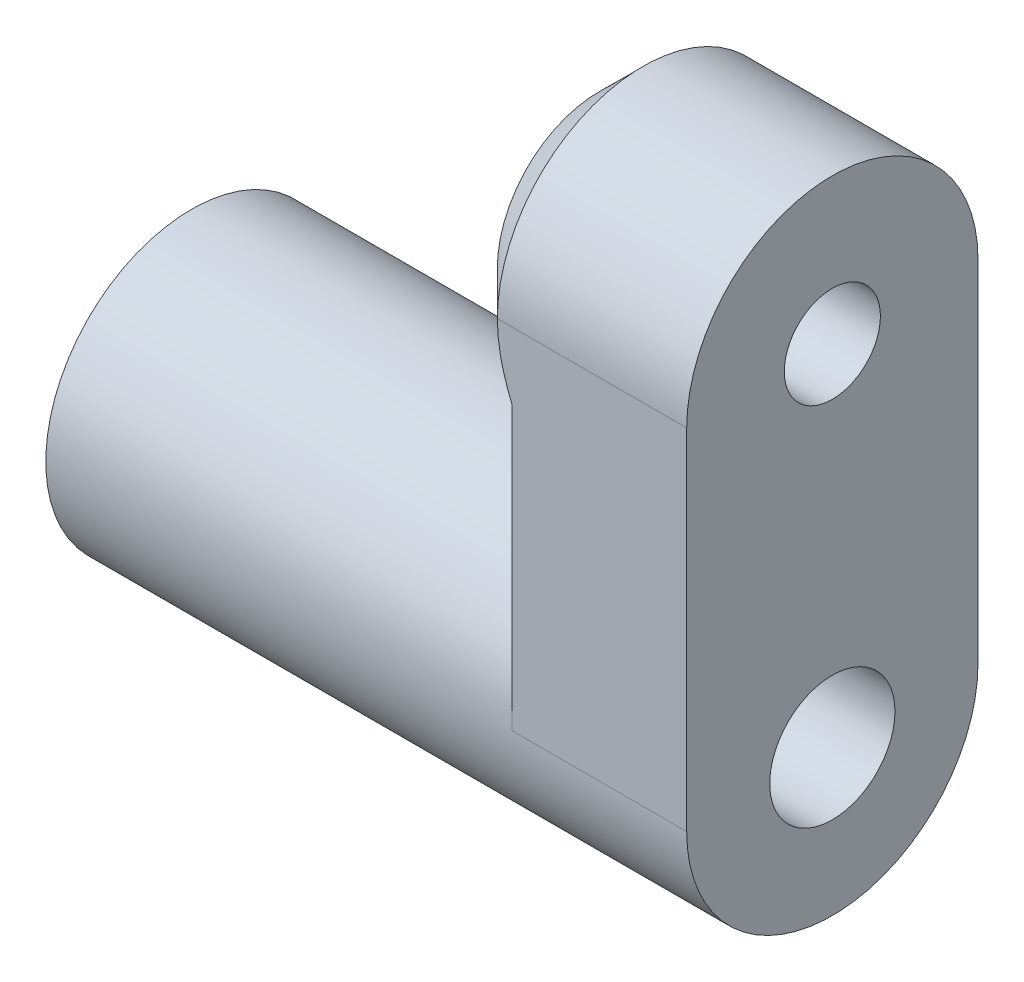
ISO-10303-21;
HEADER;
FILE_DESCRIPTION(('STEP AP214'),'2;1');
FILE_NAME('part.step','',(''),(''),'','','');
FILE_SCHEMA(('AUTOMOTIVE_DESIGN { 1 0 10303 214 1 1 1 1 }'));
ENDSEC;
DATA;
#1=APPLICATION_CONTEXT('core data for automotive mechanical design processes');
#2=APPLICATION_PROTOCOL_DEFINITION('international standard','automotive_design',2000,#1);
#3=PRODUCT_CONTEXT('',#1,'mechanical');
#4=PRODUCT('Part','Part','',(#3));
#5=PRODUCT_RELATED_PRODUCT_CATEGORY('part','',(#4));
#6=PRODUCT_DEFINITION_FORMATION('','',#4);
#7=PRODUCT_DEFINITION_CONTEXT('part definition',#1,'design');
#8=PRODUCT_DEFINITION('design','',#6,#7);
#9=PRODUCT_DEFINITION_SHAPE('','',#8);
#10=(LENGTH_UNIT() NAMED_UNIT(*) SI_UNIT(.MILLI.,.METRE.));
#11=(NAMED_UNIT(*) PLANE_ANGLE_UNIT() SI_UNIT($,.RADIAN.));
#12=(NAMED_UNIT(*) SI_UNIT($,.STERADIAN.) SOLID_ANGLE_UNIT());
#13=UNCERTAINTY_MEASURE_WITH_UNIT(LENGTH_MEASURE(1.E-05),#10,'distance_accuracy_value','');
#14=(GEOMETRIC_REPRESENTATION_CONTEXT(3) GLOBAL_UNCERTAINTY_ASSIGNED_CONTEXT((#13)) GLOBAL_UNIT_ASSIGNED_CONTEXT((#10,
#11,#12)) REPRESENTATION_CONTEXT('',''));
#15=CARTESIAN_POINT('',(0.,0.,0.));
#16=DIRECTION('',(0.,0.,1.));
#17=DIRECTION('',(1.,0.,0.));
#18=AXIS2_PLACEMENT_3D('',#15,#16,#17);
#19=CARTESIAN_POINT('',(16.,0.,0.));
#20=DIRECTION('',(1.,0.,0.));
#21=DIRECTION('',(0.,0.,-1.));
#22=AXIS2_PLACEMENT_3D('',#19,#20,#21);
#23=PLANE('',#22);
#24=DIRECTION('',(0.,-1.,0.));
#25=VECTOR('',#24,1.);
#26=CARTESIAN_POINT('',(16.,0.,5.));
#27=LINE('',#26,#25);
#28=CARTESIAN_POINT('',(16.,9.70871215252205,5.));
#29=VERTEX_POINT('',#28);
#30=CARTESIAN_POINT('',(16.,0.,5.));
#31=VERTEX_POINT('',#30);
#32=EDGE_CURVE('E176',#29,#31,#27,.T.);
#33=ORIENTED_EDGE('',*,*,#32,.F.);
#34=CARTESIAN_POINT('',(16.,12.,0.));
#35=DIRECTION('',(1.,0.,0.));
#36=DIRECTION('',(0.,0.,-1.));
#37=AXIS2_PLACEMENT_3D('',#34,#35,#36);
#38=CIRCLE('',#37,5.50000000000001);
#39=CARTESIAN_POINT('',(16.,9.70871215252205,-5.));
#40=VERTEX_POINT('',#39);
#41=EDGE_CURVE('E130',#29,#40,#38,.T.);
#42=ORIENTED_EDGE('',*,*,#41,.T.);
#43=DIRECTION('',(0.,-1.,0.));
#44=VECTOR('',#43,1.);
#45=CARTESIAN_POINT('',(16.,0.,-5.));
#46=LINE('',#45,#44);
#47=CARTESIAN_POINT('',(16.,0.,-5.));
#48=VERTEX_POINT('',#47);
#49=EDGE_CURVE('E179',#40,#48,#46,.T.);
#50=ORIENTED_EDGE('',*,*,#49,.T.);
#51=CARTESIAN_POINT('',(16.,0.,0.));
#52=DIRECTION('',(1.,0.,0.));
#53=DIRECTION('',(0.,0.,-1.));
#54=AXIS2_PLACEMENT_3D('',#51,#52,#53);
#55=CIRCLE('',#54,5.);
#56=EDGE_CURVE('E127',#48,#31,#55,.T.);
#57=ORIENTED_EDGE('',*,*,#56,.T.);
#58=EDGE_LOOP('',(#33,#42,#50,#57));
#59=FACE_BOUND('',#58,.T.);
#60=ADVANCED_FACE('F47',(#59),#23,.F.);
#61=CARTESIAN_POINT('',(0.,0.,0.));
#62=DIRECTION('',(1.,0.,0.));
#63=DIRECTION('',(0.,0.,-1.));
#64=AXIS2_PLACEMENT_3D('',#61,#62,#63);
#65=PLANE('',#64);
#66=CARTESIAN_POINT('',(0.,0.,0.));
#67=DIRECTION('',(1.,0.,0.));
#68=DIRECTION('',(0.,0.,-1.));
#69=AXIS2_PLACEMENT_3D('',#66,#67,#68);
#70=CIRCLE('',#69,5.);
#71=CARTESIAN_POINT('',(0.,0.,-5.));
#72=VERTEX_POINT('',#71);
#73=EDGE_CURVE('E121',#72,#72,#70,.T.);
#74=ORIENTED_EDGE('',*,*,#73,.F.);
#75=EDGE_LOOP('',(#74));
#76=FACE_BOUND('',#75,.T.);
#77=CARTESIAN_POINT('',(0.,0.,0.));
#78=DIRECTION('',(1.,0.,0.));
#79=DIRECTION('',(0.,0.,-1.));
#80=AXIS2_PLACEMENT_3D('',#77,#78,#79);
#81=CIRCLE('',#80,2.15);
#82=CARTESIAN_POINT('',(0.,0.,-2.15));
#83=VERTEX_POINT('',#82);
#84=EDGE_CURVE('E118',#83,#83,#81,.T.);
#85=ORIENTED_EDGE('',*,*,#84,.T.);
#86=EDGE_LOOP('',(#85));
#87=FACE_BOUND('',#86,.T.);
#88=ADVANCED_FACE('F161',(#76,#87),#65,.F.);
#89=CARTESIAN_POINT('',(16.,0.,0.));
#90=DIRECTION('',(-1.,0.,0.));
#91=DIRECTION('',(0.,0.,1.));
#92=AXIS2_PLACEMENT_3D('',#89,#90,#91);
#93=CYLINDRICAL_SURFACE('',#92,5.);
#94=ORIENTED_EDGE('',*,*,#56,.F.);
#95=DIRECTION('',(-1.,0.,0.));
#96=VECTOR('',#95,1.);
#97=CARTESIAN_POINT('',(22.,0.,-5.));
#98=LINE('',#97,#96);
#99=CARTESIAN_POINT('',(22.,0.,-5.));
#100=VERTEX_POINT('',#99);
#101=EDGE_CURVE('E123',#100,#48,#98,.T.);
#102=ORIENTED_EDGE('',*,*,#101,.F.);
#103=CARTESIAN_POINT('',(22.,0.,0.));
#104=DIRECTION('',(1.,0.,0.));
#105=DIRECTION('',(0.,0.,-1.));
#106=AXIS2_PLACEMENT_3D('',#103,#104,#105);
#107=CIRCLE('',#106,5.);
#108=CARTESIAN_POINT('',(22.,0.,5.));
#109=VERTEX_POINT('',#108);
#110=EDGE_CURVE('E105',#109,#100,#107,.T.);
#111=ORIENTED_EDGE('',*,*,#110,.F.);
#112=DIRECTION('',(-1.,0.,0.));
#113=VECTOR('',#112,1.);
#114=CARTESIAN_POINT('',(22.,0.,5.));
#115=LINE('',#114,#113);
#116=EDGE_CURVE('E102',#109,#31,#115,.T.);
#117=ORIENTED_EDGE('',*,*,#116,.T.);
#118=EDGE_LOOP('',(#94,#102,#111,#117));
#119=FACE_BOUND('',#118,.T.);
#120=ORIENTED_EDGE('',*,*,#73,.T.);
#121=EDGE_LOOP('',(#120));
#122=FACE_BOUND('',#121,.T.);
#123=ADVANCED_FACE('F159',(#119,#122),#93,.T.);
#124=CARTESIAN_POINT('',(16.,0.,0.));
#125=DIRECTION('',(-1.,0.,0.));
#126=DIRECTION('',(0.,0.,1.));
#127=AXIS2_PLACEMENT_3D('',#124,#125,#126);
#128=CYLINDRICAL_SURFACE('',#127,2.15);
#129=ORIENTED_EDGE('',*,*,#84,.F.);
#130=EDGE_LOOP('',(#129));
#131=FACE_BOUND('',#130,.T.);
#132=CARTESIAN_POINT('',(22.,0.,0.));
#133=DIRECTION('',(1.,0.,0.));
#134=DIRECTION('',(0.,0.,-1.));
#135=AXIS2_PLACEMENT_3D('',#132,#133,#134);
#136=CIRCLE('',#135,2.15);
#137=CARTESIAN_POINT('',(22.,0.,-2.15));
#138=VERTEX_POINT('',#137);
#139=EDGE_CURVE('E191',#138,#138,#136,.F.);
#140=ORIENTED_EDGE('',*,*,#139,.F.);
#141=EDGE_LOOP('',(#140));
#142=FACE_BOUND('',#141,.T.);
#143=ADVANCED_FACE('F153',(#131,#142),#128,.F.);
#144=CARTESIAN_POINT('',(22.,12.,0.));
#145=DIRECTION('',(-1.,0.,0.));
#146=DIRECTION('',(0.,0.,1.));
#147=AXIS2_PLACEMENT_3D('',#144,#145,#146);
#148=CYLINDRICAL_SURFACE('',#147,5.);
#149=DIRECTION('',(-1.,0.,0.));
#150=VECTOR('',#149,1.);
#151=CARTESIAN_POINT('',(22.,12.,-5.));
#152=LINE('',#151,#150);
#153=CARTESIAN_POINT('',(22.,12.,-5.));
#154=VERTEX_POINT('',#153);
#155=CARTESIAN_POINT('',(15.5,12.,-5.));
#156=VERTEX_POINT('',#155);
#157=EDGE_CURVE('E75',#154,#156,#152,.T.);
#158=ORIENTED_EDGE('',*,*,#157,.T.);
#159=CARTESIAN_POINT('',(15.5,12.,0.));
#160=DIRECTION('',(1.,0.,0.));
#161=DIRECTION('',(0.,0.,-1.));
#162=AXIS2_PLACEMENT_3D('',#159,#160,#161);
#163=CIRCLE('',#162,5.);
#164=CARTESIAN_POINT('',(15.5,12.,5.));
#165=VERTEX_POINT('',#164);
#166=EDGE_CURVE('E62',#156,#165,#163,.T.);
#167=ORIENTED_EDGE('',*,*,#166,.T.);
#168=DIRECTION('',(-1.,0.,0.));
#169=VECTOR('',#168,1.);
#170=CARTESIAN_POINT('',(22.,12.,5.));
#171=LINE('',#170,#169);
#172=CARTESIAN_POINT('',(22.,12.,5.));
#173=VERTEX_POINT('',#172);
#174=EDGE_CURVE('E68',#173,#165,#171,.T.);
#175=ORIENTED_EDGE('',*,*,#174,.F.);
#176=CARTESIAN_POINT('',(22.,12.,0.));
#177=DIRECTION('',(1.,0.,0.));
#178=DIRECTION('',(0.,0.,-1.));
#179=AXIS2_PLACEMENT_3D('',#176,#177,#178);
#180=CIRCLE('',#179,5.);
#181=EDGE_CURVE('E106',#154,#173,#180,.T.);
#182=ORIENTED_EDGE('',*,*,#181,.F.);
#183=EDGE_LOOP('',(#158,#167,#175,#182));
#184=FACE_BOUND('',#183,.T.);
#185=ADVANCED_FACE('F115',(#184),#148,.T.);
#186=CARTESIAN_POINT('',(22.,0.,5.));
#187=DIRECTION('',(0.,0.,-1.));
#188=DIRECTION('',(0.,1.,0.));
#189=AXIS2_PLACEMENT_3D('',#186,#187,#188);
#190=PLANE('',#189);
#191=ORIENTED_EDGE('',*,*,#174,.T.);
#192=CARTESIAN_POINT('',(15.5,12.,5.));
#193=CARTESIAN_POINT('',(15.4999938808641,11.9232845514094,5.));
#194=CARTESIAN_POINT('',(15.5017664645557,11.8465805571081,5.));
#195=CARTESIAN_POINT('',(15.5088113614359,11.6933450860362,5.));
#196=CARTESIAN_POINT('',(15.5140831273911,11.6168135841673,5.));
#197=CARTESIAN_POINT('',(15.5350373481858,11.3879305785124,5.));
#198=CARTESIAN_POINT('',(15.5558591226562,11.2360240896686,5.));
#199=CARTESIAN_POINT('',(15.6097448587274,10.9365440688364,5.));
#200=CARTESIAN_POINT('',(15.6426424330577,10.788939781945,5.));
#201=CARTESIAN_POINT('',(15.7192338848682,10.4965656361896,5.));
#202=CARTESIAN_POINT('',(15.7629287587174,10.3517960402407,5.));
#203=CARTESIAN_POINT('',(15.8396339438448,10.1243701547718,5.));
#204=CARTESIAN_POINT('',(15.8696377446425,10.0406780069047,5.));
#205=CARTESIAN_POINT('',(15.9326535749736,9.87404381596682,5.));
#206=CARTESIAN_POINT('',(15.9656773190533,9.79110619565018,5.));
#207=CARTESIAN_POINT('',(16.,9.70871215252204,5.));
#208=B_SPLINE_CURVE_WITH_KNOTS('',3,(#192,#193,#194,#195,#196,#197,#198,#199,#200,#201,#202,
#203,#204,#205,#206,#207),.UNSPECIFIED.,.F.,.F.,(4,2,2,2,2,2,2,4),(0.,0.230103965457578,
0.460171953668387,0.919511473698916,1.37274597747733,1.82602232112228,2.09269913724655,
2.36045824725333),.UNSPECIFIED.);
#209=EDGE_CURVE('E11',#165,#29,#208,.T.);
#210=ORIENTED_EDGE('',*,*,#209,.T.);
#211=ORIENTED_EDGE('',*,*,#32,.T.);
#212=ORIENTED_EDGE('',*,*,#116,.F.);
#213=DIRECTION('',(0.,-1.,0.));
#214=VECTOR('',#213,1.);
#215=CARTESIAN_POINT('',(22.,0.,5.));
#216=LINE('',#215,#214);
#217=EDGE_CURVE('E98',#173,#109,#216,.T.);
#218=ORIENTED_EDGE('',*,*,#217,.F.);
#219=EDGE_LOOP('',(#191,#210,#211,#212,#218));
#220=FACE_BOUND('',#219,.T.);
#221=ADVANCED_FACE('F100',(#220),#190,.F.);
#222=CARTESIAN_POINT('',(22.,0.,-5.));
#223=DIRECTION('',(0.,0.,-1.));
#224=DIRECTION('',(0.,1.,0.));
#225=AXIS2_PLACEMENT_3D('',#222,#223,#224);
#226=PLANE('',#225);
#227=ORIENTED_EDGE('',*,*,#49,.F.);
#228=CARTESIAN_POINT('',(16.,9.70871215252205,-5.));
#229=CARTESIAN_POINT('',(15.9240808009228,9.89084793552308,-5.));
#230=CARTESIAN_POINT('',(15.8544564809825,10.0759888500897,-5.));
#231=CARTESIAN_POINT('',(15.7319135578911,10.4496426129944,-5.));
#232=CARTESIAN_POINT('',(15.6788364246005,10.6381039484844,-5.));
#233=CARTESIAN_POINT('',(15.6135633036609,10.9242681078303,-5.));
#234=CARTESIAN_POINT('',(15.5941836427533,11.0203343069844,-5.));
#235=CARTESIAN_POINT('',(15.5606081991895,11.2133708835708,-5.));
#236=CARTESIAN_POINT('',(15.5464121712465,11.310341217997,-5.));
#237=CARTESIAN_POINT('',(15.5234087589426,11.5058960835902,-5.));
#238=CARTESIAN_POINT('',(15.5146560425683,11.6044870950536,-5.));
#239=CARTESIAN_POINT('',(15.502938452585,11.8020489039693,-5.));
#240=CARTESIAN_POINT('',(15.4999758026711,11.9010198327149,-5.));
#241=CARTESIAN_POINT('',(15.5,12.,-5.));
#242=B_SPLINE_CURVE_WITH_KNOTS('',3,(#228,#229,#230,#231,#232,#233,#234,#235,#236,#237,#238,
#239,#240,#241),.UNSPECIFIED.,.F.,.F.,(4,2,2,2,2,2,4),(0.,0.592418733123167,1.17897377993223,
1.47284954457351,1.76671140137237,2.06347881375194,2.36036017831086),.UNSPECIFIED.);
#243=EDGE_CURVE('E135',#40,#156,#242,.T.);
#244=ORIENTED_EDGE('',*,*,#243,.T.);
#245=ORIENTED_EDGE('',*,*,#157,.F.);
#246=DIRECTION('',(0.,-1.,0.));
#247=VECTOR('',#246,1.);
#248=CARTESIAN_POINT('',(22.,0.,-5.));
#249=LINE('',#248,#247);
#250=EDGE_CURVE('E112',#154,#100,#249,.T.);
#251=ORIENTED_EDGE('',*,*,#250,.T.);
#252=ORIENTED_EDGE('',*,*,#101,.T.);
#253=EDGE_LOOP('',(#227,#244,#245,#251,#252));
#254=FACE_BOUND('',#253,.T.);
#255=ADVANCED_FACE('F141',(#254),#226,.T.);
#256=CARTESIAN_POINT('',(22.,12.,0.));
#257=DIRECTION('',(-1.,0.,0.));
#258=DIRECTION('',(0.,0.,1.));
#259=AXIS2_PLACEMENT_3D('',#256,#257,#258);
#260=CYLINDRICAL_SURFACE('',#259,1.65);
#261=CARTESIAN_POINT('',(22.,12.,0.));
#262=DIRECTION('',(1.,0.,0.));
#263=DIRECTION('',(0.,0.,-1.));
#264=AXIS2_PLACEMENT_3D('',#261,#262,#263);
#265=CIRCLE('',#264,1.65);
#266=CARTESIAN_POINT('',(22.,12.,-1.65));
#267=VERTEX_POINT('',#266);
#268=EDGE_CURVE('E113',#267,#267,#265,.T.);
#269=ORIENTED_EDGE('',*,*,#268,.T.);
#270=EDGE_LOOP('',(#269));
#271=FACE_BOUND('',#270,.T.);
#272=CARTESIAN_POINT('',(14.,12.,0.));
#273=DIRECTION('',(-1.,0.,0.));
#274=DIRECTION('',(0.,0.,1.));
#275=AXIS2_PLACEMENT_3D('',#272,#273,#274);
#276=CIRCLE('',#275,1.65);
#277=CARTESIAN_POINT('',(14.,12.,1.65));
#278=VERTEX_POINT('',#277);
#279=EDGE_CURVE('E199',#278,#278,#276,.T.);
#280=ORIENTED_EDGE('',*,*,#279,.T.);
#281=EDGE_LOOP('',(#280));
#282=FACE_BOUND('',#281,.T.);
#283=ADVANCED_FACE('F145',(#271,#282),#260,.F.);
#284=CARTESIAN_POINT('',(22.,0.,0.));
#285=DIRECTION('',(1.,0.,0.));
#286=DIRECTION('',(0.,0.,-1.));
#287=AXIS2_PLACEMENT_3D('',#284,#285,#286);
#288=PLANE('',#287);
#289=ORIENTED_EDGE('',*,*,#268,.F.);
#290=EDGE_LOOP('',(#289));
#291=FACE_BOUND('',#290,.T.);
#292=ORIENTED_EDGE('',*,*,#181,.T.);
#293=ORIENTED_EDGE('',*,*,#217,.T.);
#294=ORIENTED_EDGE('',*,*,#110,.T.);
#295=ORIENTED_EDGE('',*,*,#250,.F.);
#296=EDGE_LOOP('',(#292,#293,#294,#295));
#297=FACE_BOUND('',#296,.T.);
#298=ORIENTED_EDGE('',*,*,#139,.T.);
#299=EDGE_LOOP('',(#298));
#300=FACE_BOUND('',#299,.T.);
#301=ADVANCED_FACE('F109',(#291,#297,#300),#288,.T.);
#302=CARTESIAN_POINT('',(14.,12.,0.));
#303=DIRECTION('',(-1.,0.,0.));
#304=DIRECTION('',(0.,0.,1.));
#305=AXIS2_PLACEMENT_3D('',#302,#303,#304);
#306=PLANE('',#305);
#307=CARTESIAN_POINT('',(14.,12.,0.));
#308=DIRECTION('',(-1.,0.,0.));
#309=DIRECTION('',(0.,0.,1.));
#310=AXIS2_PLACEMENT_3D('',#307,#308,#309);
#311=CIRCLE('',#310,3.5);
#312=CARTESIAN_POINT('',(14.,12.,3.5));
#313=VERTEX_POINT('',#312);
#314=EDGE_CURVE('E180',#313,#313,#311,.T.);
#315=ORIENTED_EDGE('',*,*,#314,.T.);
#316=EDGE_LOOP('',(#315));
#317=FACE_BOUND('',#316,.T.);
#318=ORIENTED_EDGE('',*,*,#279,.F.);
#319=EDGE_LOOP('',(#318));
#320=FACE_BOUND('',#319,.T.);
#321=ADVANCED_FACE('F204',(#317,#320),#306,.T.);
#322=CARTESIAN_POINT('',(14.,12.,0.));
#323=DIRECTION('',(1.,0.,0.));
#324=DIRECTION('',(0.,0.,-1.));
#325=AXIS2_PLACEMENT_3D('',#322,#323,#324);
#326=CONICAL_SURFACE('',#325,3.5,0.785398163397443);
#327=ORIENTED_EDGE('',*,*,#243,.F.);
#328=ORIENTED_EDGE('',*,*,#41,.F.);
#329=ORIENTED_EDGE('',*,*,#209,.F.);
#330=ORIENTED_EDGE('',*,*,#166,.F.);
#331=EDGE_LOOP('',(#327,#328,#329,#330));
#332=FACE_BOUND('',#331,.T.);
#333=ORIENTED_EDGE('',*,*,#314,.F.);
#334=EDGE_LOOP('',(#333));
#335=FACE_BOUND('',#334,.T.);
#336=ADVANCED_FACE('F50',(#332,#335),#326,.T.);
#337=CLOSED_SHELL('',(#60,#88,#123,#143,#185,#221,#255,#283,#301,#321,#336));
#338=MANIFOLD_SOLID_BREP('B2',#337);
#339=ADVANCED_BREP_SHAPE_REPRESENTATION('',(#18,#338),#14);
#340=SHAPE_DEFINITION_REPRESENTATION(#9,#339);
ENDSEC;
END-ISO-10303-21;
